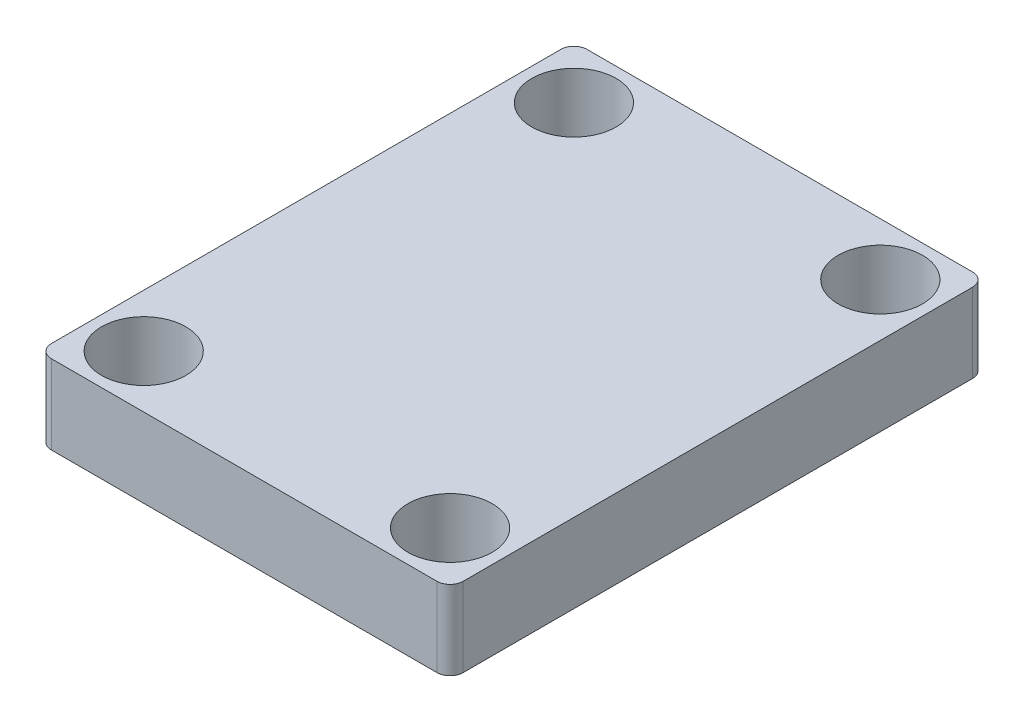
ISO-10303-21;
HEADER;
FILE_DESCRIPTION(('STEP AP214'),'2;1');
FILE_NAME('part.step','',(''),(''),'','','');
FILE_SCHEMA(('AUTOMOTIVE_DESIGN { 1 0 10303 214 1 1 1 1 }'));
ENDSEC;
DATA;
#1=APPLICATION_CONTEXT('core data for automotive mechanical design processes');
#2=APPLICATION_PROTOCOL_DEFINITION('international standard','automotive_design',2000,#1);
#3=PRODUCT_CONTEXT('',#1,'mechanical');
#4=PRODUCT('Part','Part','',(#3));
#5=PRODUCT_RELATED_PRODUCT_CATEGORY('part','',(#4));
#6=PRODUCT_DEFINITION_FORMATION('','',#4);
#7=PRODUCT_DEFINITION_CONTEXT('part definition',#1,'design');
#8=PRODUCT_DEFINITION('design','',#6,#7);
#9=PRODUCT_DEFINITION_SHAPE('','',#8);
#10=(LENGTH_UNIT() NAMED_UNIT(*) SI_UNIT(.MILLI.,.METRE.));
#11=(NAMED_UNIT(*) PLANE_ANGLE_UNIT() SI_UNIT($,.RADIAN.));
#12=(NAMED_UNIT(*) SI_UNIT($,.STERADIAN.) SOLID_ANGLE_UNIT());
#13=UNCERTAINTY_MEASURE_WITH_UNIT(LENGTH_MEASURE(1.E-05),#10,'distance_accuracy_value','');
#14=(GEOMETRIC_REPRESENTATION_CONTEXT(3) GLOBAL_UNCERTAINTY_ASSIGNED_CONTEXT((#13)) GLOBAL_UNIT_ASSIGNED_CONTEXT((#10,
#11,#12)) REPRESENTATION_CONTEXT('',''));
#15=CARTESIAN_POINT('',(0.,0.,0.));
#16=DIRECTION('',(0.,0.,1.));
#17=DIRECTION('',(1.,0.,0.));
#18=AXIS2_PLACEMENT_3D('',#15,#16,#17);
#19=CARTESIAN_POINT('',(0.,3.,0.));
#20=DIRECTION('',(0.,-1.,0.));
#21=DIRECTION('',(0.,0.,-1.));
#22=AXIS2_PLACEMENT_3D('',#19,#20,#21);
#23=PLANE('',#22);
#24=DIRECTION('',(0.,0.,1.));
#25=VECTOR('',#24,1.);
#26=CARTESIAN_POINT('',(-7.8105,3.,10.16));
#27=LINE('',#26,#25);
#28=CARTESIAN_POINT('',(-7.8105,3.,-9.66));
#29=VERTEX_POINT('',#28);
#30=CARTESIAN_POINT('',(-7.8105,3.,9.66));
#31=VERTEX_POINT('',#30);
#32=EDGE_CURVE('E205',#29,#31,#27,.T.);
#33=ORIENTED_EDGE('',*,*,#32,.T.);
#34=CARTESIAN_POINT('',(-7.3105,3.,9.66));
#35=DIRECTION('',(0.,-1.,0.));
#36=DIRECTION('',(0.,0.,-1.));
#37=AXIS2_PLACEMENT_3D('',#34,#35,#36);
#38=CIRCLE('',#37,0.5);
#39=CARTESIAN_POINT('',(-7.3105,3.,10.16));
#40=VERTEX_POINT('',#39);
#41=EDGE_CURVE('E174',#31,#40,#38,.F.);
#42=ORIENTED_EDGE('',*,*,#41,.T.);
#43=DIRECTION('',(1.,0.,0.));
#44=VECTOR('',#43,1.);
#45=CARTESIAN_POINT('',(-7.8105,3.,10.16));
#46=LINE('',#45,#44);
#47=CARTESIAN_POINT('',(7.3105,3.,10.16));
#48=VERTEX_POINT('',#47);
#49=EDGE_CURVE('E132',#40,#48,#46,.T.);
#50=ORIENTED_EDGE('',*,*,#49,.T.);
#51=CARTESIAN_POINT('',(7.3105,3.,9.66));
#52=DIRECTION('',(0.,-1.,0.));
#53=DIRECTION('',(0.,0.,-1.));
#54=AXIS2_PLACEMENT_3D('',#51,#52,#53);
#55=CIRCLE('',#54,0.5);
#56=CARTESIAN_POINT('',(7.8105,3.,9.66));
#57=VERTEX_POINT('',#56);
#58=EDGE_CURVE('E166',#48,#57,#55,.F.);
#59=ORIENTED_EDGE('',*,*,#58,.T.);
#60=DIRECTION('',(0.,0.,-1.));
#61=VECTOR('',#60,1.);
#62=CARTESIAN_POINT('',(7.8105,3.,10.16));
#63=LINE('',#62,#61);
#64=CARTESIAN_POINT('',(7.8105,3.,-9.66));
#65=VERTEX_POINT('',#64);
#66=EDGE_CURVE('E141',#57,#65,#63,.T.);
#67=ORIENTED_EDGE('',*,*,#66,.T.);
#68=CARTESIAN_POINT('',(7.3105,3.,-9.66));
#69=DIRECTION('',(0.,-1.,0.));
#70=DIRECTION('',(0.,0.,-1.));
#71=AXIS2_PLACEMENT_3D('',#68,#69,#70);
#72=CIRCLE('',#71,0.5);
#73=CARTESIAN_POINT('',(7.3105,3.,-10.16));
#74=VERTEX_POINT('',#73);
#75=EDGE_CURVE('E67',#65,#74,#72,.F.);
#76=ORIENTED_EDGE('',*,*,#75,.T.);
#77=DIRECTION('',(-1.,0.,0.));
#78=VECTOR('',#77,1.);
#79=CARTESIAN_POINT('',(-7.8105,3.,-10.16));
#80=LINE('',#79,#78);
#81=CARTESIAN_POINT('',(-7.3105,3.,-10.16));
#82=VERTEX_POINT('',#81);
#83=EDGE_CURVE('E146',#74,#82,#80,.T.);
#84=ORIENTED_EDGE('',*,*,#83,.T.);
#85=CARTESIAN_POINT('',(-7.3105,3.,-9.66));
#86=DIRECTION('',(0.,-1.,0.));
#87=DIRECTION('',(0.,0.,-1.));
#88=AXIS2_PLACEMENT_3D('',#85,#86,#87);
#89=CIRCLE('',#88,0.5);
#90=EDGE_CURVE('E171',#82,#29,#89,.F.);
#91=ORIENTED_EDGE('',*,*,#90,.T.);
#92=EDGE_LOOP('',(#33,#42,#50,#59,#67,#76,#84,#91));
#93=FACE_BOUND('',#92,.T.);
#94=CARTESIAN_POINT('',(5.8105,3.,8.16));
#95=DIRECTION('',(0.,1.,0.));
#96=DIRECTION('',(0.,0.,1.));
#97=AXIS2_PLACEMENT_3D('',#94,#95,#96);
#98=CIRCLE('',#97,1.6);
#99=CARTESIAN_POINT('',(5.8105,3.,9.76));
#100=VERTEX_POINT('',#99);
#101=EDGE_CURVE('E195',#100,#100,#98,.T.);
#102=ORIENTED_EDGE('',*,*,#101,.F.);
#103=EDGE_LOOP('',(#102));
#104=FACE_BOUND('',#103,.T.);
#105=CARTESIAN_POINT('',(-5.8105,3.,8.16));
#106=DIRECTION('',(0.,1.,0.));
#107=DIRECTION('',(0.,0.,-1.));
#108=AXIS2_PLACEMENT_3D('',#105,#106,#107);
#109=CIRCLE('',#108,1.6);
#110=CARTESIAN_POINT('',(-5.8105,3.,6.56));
#111=VERTEX_POINT('',#110);
#112=EDGE_CURVE('E213',#111,#111,#109,.T.);
#113=ORIENTED_EDGE('',*,*,#112,.F.);
#114=EDGE_LOOP('',(#113));
#115=FACE_BOUND('',#114,.T.);
#116=CARTESIAN_POINT('',(5.8105,3.,-8.16));
#117=DIRECTION('',(0.,1.,0.));
#118=DIRECTION('',(0.,0.,-1.));
#119=AXIS2_PLACEMENT_3D('',#116,#117,#118);
#120=CIRCLE('',#119,1.6);
#121=CARTESIAN_POINT('',(5.8105,3.,-9.76));
#122=VERTEX_POINT('',#121);
#123=EDGE_CURVE('E219',#122,#122,#120,.T.);
#124=ORIENTED_EDGE('',*,*,#123,.F.);
#125=EDGE_LOOP('',(#124));
#126=FACE_BOUND('',#125,.T.);
#127=CARTESIAN_POINT('',(-5.8105,3.,-8.16));
#128=DIRECTION('',(0.,1.,0.));
#129=DIRECTION('',(0.,0.,1.));
#130=AXIS2_PLACEMENT_3D('',#127,#128,#129);
#131=CIRCLE('',#130,1.6);
#132=CARTESIAN_POINT('',(-5.8105,3.,-6.56));
#133=VERTEX_POINT('',#132);
#134=EDGE_CURVE('E227',#133,#133,#131,.T.);
#135=ORIENTED_EDGE('',*,*,#134,.F.);
#136=EDGE_LOOP('',(#135));
#137=FACE_BOUND('',#136,.T.);
#138=ADVANCED_FACE('F44',(#93,#104,#115,#126,#137),#23,.F.);
#139=CARTESIAN_POINT('',(0.,0.,0.));
#140=DIRECTION('',(0.,-1.,0.));
#141=DIRECTION('',(0.,0.,-1.));
#142=AXIS2_PLACEMENT_3D('',#139,#140,#141);
#143=PLANE('',#142);
#144=CARTESIAN_POINT('',(5.8105,0.,-8.16));
#145=DIRECTION('',(0.,1.,0.));
#146=DIRECTION('',(0.,0.,-1.));
#147=AXIS2_PLACEMENT_3D('',#144,#145,#146);
#148=CIRCLE('',#147,1.6);
#149=CARTESIAN_POINT('',(5.8105,0.,-9.76));
#150=VERTEX_POINT('',#149);
#151=EDGE_CURVE('E223',#150,#150,#148,.T.);
#152=ORIENTED_EDGE('',*,*,#151,.T.);
#153=EDGE_LOOP('',(#152));
#154=FACE_BOUND('',#153,.T.);
#155=CARTESIAN_POINT('',(5.8105,0.,8.16));
#156=DIRECTION('',(0.,1.,0.));
#157=DIRECTION('',(0.,0.,1.));
#158=AXIS2_PLACEMENT_3D('',#155,#156,#157);
#159=CIRCLE('',#158,1.6);
#160=CARTESIAN_POINT('',(5.8105,0.,9.76));
#161=VERTEX_POINT('',#160);
#162=EDGE_CURVE('E200',#161,#161,#159,.T.);
#163=ORIENTED_EDGE('',*,*,#162,.T.);
#164=EDGE_LOOP('',(#163));
#165=FACE_BOUND('',#164,.T.);
#166=DIRECTION('',(1.,0.,0.));
#167=VECTOR('',#166,1.);
#168=CARTESIAN_POINT('',(-7.8105,0.,10.16));
#169=LINE('',#168,#167);
#170=CARTESIAN_POINT('',(-7.3105,0.,10.16));
#171=VERTEX_POINT('',#170);
#172=CARTESIAN_POINT('',(7.3105,0.,10.16));
#173=VERTEX_POINT('',#172);
#174=EDGE_CURVE('E129',#171,#173,#169,.T.);
#175=ORIENTED_EDGE('',*,*,#174,.F.);
#176=CARTESIAN_POINT('',(-7.3105,0.,9.66));
#177=DIRECTION('',(0.,-1.,0.));
#178=DIRECTION('',(0.,0.,-1.));
#179=AXIS2_PLACEMENT_3D('',#176,#177,#178);
#180=CIRCLE('',#179,0.5);
#181=CARTESIAN_POINT('',(-7.8105,0.,9.66));
#182=VERTEX_POINT('',#181);
#183=EDGE_CURVE('E111',#171,#182,#180,.T.);
#184=ORIENTED_EDGE('',*,*,#183,.T.);
#185=DIRECTION('',(0.,0.,1.));
#186=VECTOR('',#185,1.);
#187=CARTESIAN_POINT('',(-7.8105,0.,10.16));
#188=LINE('',#187,#186);
#189=CARTESIAN_POINT('',(-7.8105,0.,-9.66));
#190=VERTEX_POINT('',#189);
#191=EDGE_CURVE('E142',#190,#182,#188,.T.);
#192=ORIENTED_EDGE('',*,*,#191,.F.);
#193=CARTESIAN_POINT('',(-7.3105,0.,-9.66));
#194=DIRECTION('',(0.,-1.,0.));
#195=DIRECTION('',(0.,0.,-1.));
#196=AXIS2_PLACEMENT_3D('',#193,#194,#195);
#197=CIRCLE('',#196,0.5);
#198=CARTESIAN_POINT('',(-7.3105,0.,-10.16));
#199=VERTEX_POINT('',#198);
#200=EDGE_CURVE('E123',#190,#199,#197,.T.);
#201=ORIENTED_EDGE('',*,*,#200,.T.);
#202=DIRECTION('',(-1.,0.,0.));
#203=VECTOR('',#202,1.);
#204=CARTESIAN_POINT('',(-7.8105,0.,-10.16));
#205=LINE('',#204,#203);
#206=CARTESIAN_POINT('',(7.3105,0.,-10.16));
#207=VERTEX_POINT('',#206);
#208=EDGE_CURVE('E148',#207,#199,#205,.T.);
#209=ORIENTED_EDGE('',*,*,#208,.F.);
#210=CARTESIAN_POINT('',(7.3105,0.,-9.66));
#211=DIRECTION('',(0.,-1.,0.));
#212=DIRECTION('',(0.,0.,-1.));
#213=AXIS2_PLACEMENT_3D('',#210,#211,#212);
#214=CIRCLE('',#213,0.5);
#215=CARTESIAN_POINT('',(7.8105,0.,-9.66));
#216=VERTEX_POINT('',#215);
#217=EDGE_CURVE('E156',#207,#216,#214,.T.);
#218=ORIENTED_EDGE('',*,*,#217,.T.);
#219=DIRECTION('',(0.,0.,-1.));
#220=VECTOR('',#219,1.);
#221=CARTESIAN_POINT('',(7.8105,0.,10.16));
#222=LINE('',#221,#220);
#223=CARTESIAN_POINT('',(7.8105,0.,9.66));
#224=VERTEX_POINT('',#223);
#225=EDGE_CURVE('E189',#224,#216,#222,.T.);
#226=ORIENTED_EDGE('',*,*,#225,.F.);
#227=CARTESIAN_POINT('',(7.3105,0.,9.66));
#228=DIRECTION('',(0.,-1.,0.));
#229=DIRECTION('',(0.,0.,-1.));
#230=AXIS2_PLACEMENT_3D('',#227,#228,#229);
#231=CIRCLE('',#230,0.5);
#232=EDGE_CURVE('E134',#224,#173,#231,.T.);
#233=ORIENTED_EDGE('',*,*,#232,.T.);
#234=EDGE_LOOP('',(#175,#184,#192,#201,#209,#218,#226,#233));
#235=FACE_BOUND('',#234,.T.);
#236=CARTESIAN_POINT('',(-5.8105,0.,8.16));
#237=DIRECTION('',(0.,1.,0.));
#238=DIRECTION('',(0.,0.,-1.));
#239=AXIS2_PLACEMENT_3D('',#236,#237,#238);
#240=CIRCLE('',#239,1.6);
#241=CARTESIAN_POINT('',(-5.8105,0.,6.56));
#242=VERTEX_POINT('',#241);
#243=EDGE_CURVE('E215',#242,#242,#240,.T.);
#244=ORIENTED_EDGE('',*,*,#243,.T.);
#245=EDGE_LOOP('',(#244));
#246=FACE_BOUND('',#245,.T.);
#247=CARTESIAN_POINT('',(-5.8105,0.,-8.16));
#248=DIRECTION('',(0.,1.,0.));
#249=DIRECTION('',(0.,0.,1.));
#250=AXIS2_PLACEMENT_3D('',#247,#248,#249);
#251=CIRCLE('',#250,1.6);
#252=CARTESIAN_POINT('',(-5.8105,0.,-6.56));
#253=VERTEX_POINT('',#252);
#254=EDGE_CURVE('E231',#253,#253,#251,.T.);
#255=ORIENTED_EDGE('',*,*,#254,.T.);
#256=EDGE_LOOP('',(#255));
#257=FACE_BOUND('',#256,.T.);
#258=ADVANCED_FACE('F137',(#154,#165,#235,#246,#257),#143,.T.);
#259=CARTESIAN_POINT('',(7.8105,3.,10.16));
#260=DIRECTION('',(-1.,0.,0.));
#261=DIRECTION('',(0.,0.,1.));
#262=AXIS2_PLACEMENT_3D('',#259,#260,#261);
#263=PLANE('',#262);
#264=ORIENTED_EDGE('',*,*,#225,.T.);
#265=DIRECTION('',(0.,-1.,0.));
#266=VECTOR('',#265,1.);
#267=CARTESIAN_POINT('',(7.8105,3.,-9.66));
#268=LINE('',#267,#266);
#269=EDGE_CURVE('E11',#216,#65,#268,.F.);
#270=ORIENTED_EDGE('',*,*,#269,.T.);
#271=ORIENTED_EDGE('',*,*,#66,.F.);
#272=DIRECTION('',(0.,-1.,0.));
#273=VECTOR('',#272,1.);
#274=CARTESIAN_POINT('',(7.8105,3.,9.66));
#275=LINE('',#274,#273);
#276=EDGE_CURVE('E53',#57,#224,#275,.T.);
#277=ORIENTED_EDGE('',*,*,#276,.T.);
#278=EDGE_LOOP('',(#264,#270,#271,#277));
#279=FACE_BOUND('',#278,.T.);
#280=ADVANCED_FACE('F188',(#279),#263,.F.);
#281=CARTESIAN_POINT('',(-7.8105,3.,-10.16));
#282=DIRECTION('',(0.,0.,1.));
#283=DIRECTION('',(1.,0.,0.));
#284=AXIS2_PLACEMENT_3D('',#281,#282,#283);
#285=PLANE('',#284);
#286=ORIENTED_EDGE('',*,*,#208,.T.);
#287=DIRECTION('',(0.,-1.,0.));
#288=VECTOR('',#287,1.);
#289=CARTESIAN_POINT('',(-7.3105,3.,-10.16));
#290=LINE('',#289,#288);
#291=EDGE_CURVE('E60',#199,#82,#290,.F.);
#292=ORIENTED_EDGE('',*,*,#291,.T.);
#293=ORIENTED_EDGE('',*,*,#83,.F.);
#294=DIRECTION('',(0.,-1.,0.));
#295=VECTOR('',#294,1.);
#296=CARTESIAN_POINT('',(7.3105,3.,-10.16));
#297=LINE('',#296,#295);
#298=EDGE_CURVE('E177',#74,#207,#297,.T.);
#299=ORIENTED_EDGE('',*,*,#298,.T.);
#300=EDGE_LOOP('',(#286,#292,#293,#299));
#301=FACE_BOUND('',#300,.T.);
#302=ADVANCED_FACE('F260',(#301),#285,.F.);
#303=CARTESIAN_POINT('',(-7.8105,3.,10.16));
#304=DIRECTION('',(1.,0.,0.));
#305=DIRECTION('',(0.,0.,-1.));
#306=AXIS2_PLACEMENT_3D('',#303,#304,#305);
#307=PLANE('',#306);
#308=ORIENTED_EDGE('',*,*,#191,.T.);
#309=DIRECTION('',(0.,-1.,0.));
#310=VECTOR('',#309,1.);
#311=CARTESIAN_POINT('',(-7.8105,3.,9.66));
#312=LINE('',#311,#310);
#313=EDGE_CURVE('E116',#182,#31,#312,.F.);
#314=ORIENTED_EDGE('',*,*,#313,.T.);
#315=ORIENTED_EDGE('',*,*,#32,.F.);
#316=DIRECTION('',(0.,-1.,0.));
#317=VECTOR('',#316,1.);
#318=CARTESIAN_POINT('',(-7.8105,3.,-9.66));
#319=LINE('',#318,#317);
#320=EDGE_CURVE('E122',#29,#190,#319,.T.);
#321=ORIENTED_EDGE('',*,*,#320,.T.);
#322=EDGE_LOOP('',(#308,#314,#315,#321));
#323=FACE_BOUND('',#322,.T.);
#324=ADVANCED_FACE('F257',(#323),#307,.F.);
#325=CARTESIAN_POINT('',(-7.8105,3.,10.16));
#326=DIRECTION('',(0.,0.,-1.));
#327=DIRECTION('',(-1.,0.,0.));
#328=AXIS2_PLACEMENT_3D('',#325,#326,#327);
#329=PLANE('',#328);
#330=ORIENTED_EDGE('',*,*,#49,.F.);
#331=DIRECTION('',(0.,-1.,0.));
#332=VECTOR('',#331,1.);
#333=CARTESIAN_POINT('',(-7.3105,3.,10.16));
#334=LINE('',#333,#332);
#335=EDGE_CURVE('E115',#40,#171,#334,.T.);
#336=ORIENTED_EDGE('',*,*,#335,.T.);
#337=ORIENTED_EDGE('',*,*,#174,.T.);
#338=DIRECTION('',(0.,-1.,0.));
#339=VECTOR('',#338,1.);
#340=CARTESIAN_POINT('',(7.3105,3.,10.16));
#341=LINE('',#340,#339);
#342=EDGE_CURVE('E135',#173,#48,#341,.F.);
#343=ORIENTED_EDGE('',*,*,#342,.T.);
#344=EDGE_LOOP('',(#330,#336,#337,#343));
#345=FACE_BOUND('',#344,.T.);
#346=ADVANCED_FACE('F128',(#345),#329,.F.);
#347=CARTESIAN_POINT('',(5.8105,3.,8.16));
#348=DIRECTION('',(0.,-1.,0.));
#349=DIRECTION('',(0.,0.,-1.));
#350=AXIS2_PLACEMENT_3D('',#347,#348,#349);
#351=CYLINDRICAL_SURFACE('',#350,1.6);
#352=ORIENTED_EDGE('',*,*,#101,.T.);
#353=EDGE_LOOP('',(#352));
#354=FACE_BOUND('',#353,.T.);
#355=ORIENTED_EDGE('',*,*,#162,.F.);
#356=EDGE_LOOP('',(#355));
#357=FACE_BOUND('',#356,.T.);
#358=ADVANCED_FACE('F252',(#354,#357),#351,.F.);
#359=CARTESIAN_POINT('',(-5.8105,3.,8.16));
#360=DIRECTION('',(0.,-1.,0.));
#361=DIRECTION('',(0.,0.,-1.));
#362=AXIS2_PLACEMENT_3D('',#359,#360,#361);
#363=CYLINDRICAL_SURFACE('',#362,1.6);
#364=ORIENTED_EDGE('',*,*,#112,.T.);
#365=EDGE_LOOP('',(#364));
#366=FACE_BOUND('',#365,.T.);
#367=ORIENTED_EDGE('',*,*,#243,.F.);
#368=EDGE_LOOP('',(#367));
#369=FACE_BOUND('',#368,.T.);
#370=ADVANCED_FACE('F317',(#366,#369),#363,.F.);
#371=CARTESIAN_POINT('',(5.8105,3.,-8.16));
#372=DIRECTION('',(0.,-1.,0.));
#373=DIRECTION('',(0.,0.,-1.));
#374=AXIS2_PLACEMENT_3D('',#371,#372,#373);
#375=CYLINDRICAL_SURFACE('',#374,1.6);
#376=ORIENTED_EDGE('',*,*,#123,.T.);
#377=EDGE_LOOP('',(#376));
#378=FACE_BOUND('',#377,.T.);
#379=ORIENTED_EDGE('',*,*,#151,.F.);
#380=EDGE_LOOP('',(#379));
#381=FACE_BOUND('',#380,.T.);
#382=ADVANCED_FACE('F308',(#378,#381),#375,.F.);
#383=CARTESIAN_POINT('',(-5.8105,3.,-8.16));
#384=DIRECTION('',(0.,-1.,0.));
#385=DIRECTION('',(0.,0.,-1.));
#386=AXIS2_PLACEMENT_3D('',#383,#384,#385);
#387=CYLINDRICAL_SURFACE('',#386,1.6);
#388=ORIENTED_EDGE('',*,*,#134,.T.);
#389=EDGE_LOOP('',(#388));
#390=FACE_BOUND('',#389,.T.);
#391=ORIENTED_EDGE('',*,*,#254,.F.);
#392=EDGE_LOOP('',(#391));
#393=FACE_BOUND('',#392,.T.);
#394=ADVANCED_FACE('F239',(#390,#393),#387,.F.);
#395=CARTESIAN_POINT('',(-7.3105,3.,9.66));
#396=DIRECTION('',(0.,-1.,0.));
#397=DIRECTION('',(0.,0.,-1.));
#398=AXIS2_PLACEMENT_3D('',#395,#396,#397);
#399=CYLINDRICAL_SURFACE('',#398,0.5);
#400=ORIENTED_EDGE('',*,*,#41,.F.);
#401=ORIENTED_EDGE('',*,*,#313,.F.);
#402=ORIENTED_EDGE('',*,*,#183,.F.);
#403=ORIENTED_EDGE('',*,*,#335,.F.);
#404=EDGE_LOOP('',(#400,#401,#402,#403));
#405=FACE_BOUND('',#404,.T.);
#406=ADVANCED_FACE('F114',(#405),#399,.T.);
#407=CARTESIAN_POINT('',(-7.3105,3.,-9.66));
#408=DIRECTION('',(0.,-1.,0.));
#409=DIRECTION('',(0.,0.,-1.));
#410=AXIS2_PLACEMENT_3D('',#407,#408,#409);
#411=CYLINDRICAL_SURFACE('',#410,0.5);
#412=ORIENTED_EDGE('',*,*,#90,.F.);
#413=ORIENTED_EDGE('',*,*,#291,.F.);
#414=ORIENTED_EDGE('',*,*,#200,.F.);
#415=ORIENTED_EDGE('',*,*,#320,.F.);
#416=EDGE_LOOP('',(#412,#413,#414,#415));
#417=FACE_BOUND('',#416,.T.);
#418=ADVANCED_FACE('F268',(#417),#411,.T.);
#419=CARTESIAN_POINT('',(7.3105,3.,-9.66));
#420=DIRECTION('',(0.,-1.,0.));
#421=DIRECTION('',(0.,0.,-1.));
#422=AXIS2_PLACEMENT_3D('',#419,#420,#421);
#423=CYLINDRICAL_SURFACE('',#422,0.5);
#424=ORIENTED_EDGE('',*,*,#75,.F.);
#425=ORIENTED_EDGE('',*,*,#269,.F.);
#426=ORIENTED_EDGE('',*,*,#217,.F.);
#427=ORIENTED_EDGE('',*,*,#298,.F.);
#428=EDGE_LOOP('',(#424,#425,#426,#427));
#429=FACE_BOUND('',#428,.T.);
#430=ADVANCED_FACE('F270',(#429),#423,.T.);
#431=CARTESIAN_POINT('',(7.3105,3.,9.66));
#432=DIRECTION('',(0.,-1.,0.));
#433=DIRECTION('',(0.,0.,-1.));
#434=AXIS2_PLACEMENT_3D('',#431,#432,#433);
#435=CYLINDRICAL_SURFACE('',#434,0.5);
#436=ORIENTED_EDGE('',*,*,#58,.F.);
#437=ORIENTED_EDGE('',*,*,#342,.F.);
#438=ORIENTED_EDGE('',*,*,#232,.F.);
#439=ORIENTED_EDGE('',*,*,#276,.F.);
#440=EDGE_LOOP('',(#436,#437,#438,#439));
#441=FACE_BOUND('',#440,.T.);
#442=ADVANCED_FACE('F46',(#441),#435,.T.);
#443=CLOSED_SHELL('',(#138,#258,#280,#302,#324,#346,#358,#370,#382,#394,#406,#418,#430,#442));
#444=MANIFOLD_SOLID_BREP('B2',#443);
#445=ADVANCED_BREP_SHAPE_REPRESENTATION('',(#18,#444),#14);
#446=SHAPE_DEFINITION_REPRESENTATION(#9,#445);
ENDSEC;
END-ISO-10303-21;
